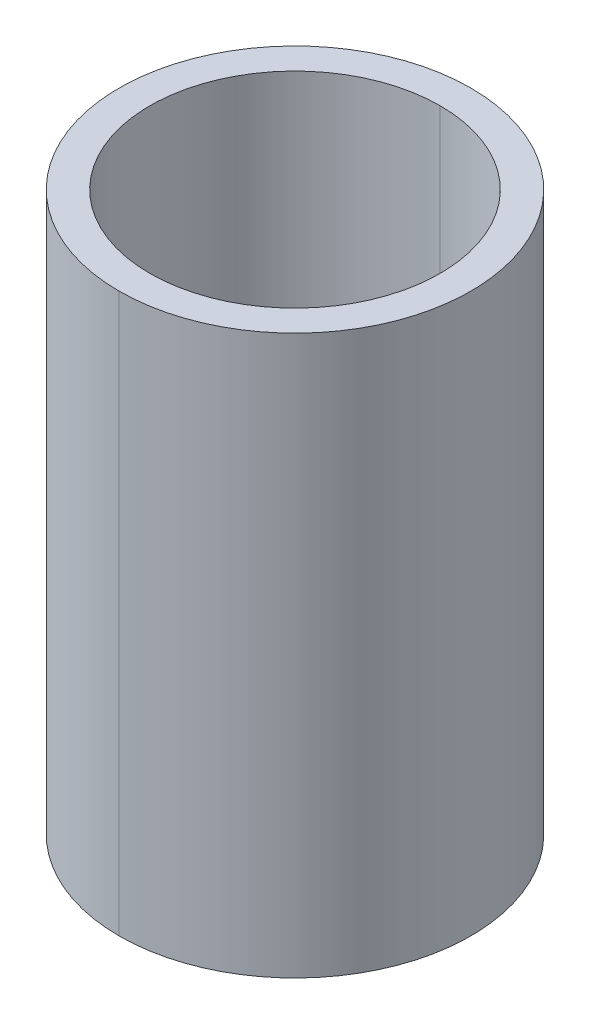
ISO-10303-21;
HEADER;
FILE_DESCRIPTION(('STEP AP214'),'2;1');
FILE_NAME('part.step','',(''),(''),'','','');
FILE_SCHEMA(('AUTOMOTIVE_DESIGN { 1 0 10303 214 1 1 1 1 }'));
ENDSEC;
DATA;
#1=APPLICATION_CONTEXT('core data for automotive mechanical design processes');
#2=APPLICATION_PROTOCOL_DEFINITION('international standard','automotive_design',2000,#1);
#3=PRODUCT_CONTEXT('',#1,'mechanical');
#4=PRODUCT('Part','Part','',(#3));
#5=PRODUCT_RELATED_PRODUCT_CATEGORY('part','',(#4));
#6=PRODUCT_DEFINITION_FORMATION('','',#4);
#7=PRODUCT_DEFINITION_CONTEXT('part definition',#1,'design');
#8=PRODUCT_DEFINITION('design','',#6,#7);
#9=PRODUCT_DEFINITION_SHAPE('','',#8);
#10=(LENGTH_UNIT() NAMED_UNIT(*) SI_UNIT(.MILLI.,.METRE.));
#11=(NAMED_UNIT(*) PLANE_ANGLE_UNIT() SI_UNIT($,.RADIAN.));
#12=(NAMED_UNIT(*) SI_UNIT($,.STERADIAN.) SOLID_ANGLE_UNIT());
#13=UNCERTAINTY_MEASURE_WITH_UNIT(LENGTH_MEASURE(1.E-05),#10,'distance_accuracy_value','');
#14=(GEOMETRIC_REPRESENTATION_CONTEXT(3) GLOBAL_UNCERTAINTY_ASSIGNED_CONTEXT((#13)) GLOBAL_UNIT_ASSIGNED_CONTEXT((#10,
#11,#12)) REPRESENTATION_CONTEXT('',''));
#15=CARTESIAN_POINT('',(0.,0.,0.));
#16=DIRECTION('',(0.,0.,1.));
#17=DIRECTION('',(1.,0.,0.));
#18=AXIS2_PLACEMENT_3D('',#15,#16,#17);
#19=CARTESIAN_POINT('',(0.,6.35,0.));
#20=DIRECTION('',(0.,-1.,0.));
#21=DIRECTION('',(0.,0.,-1.));
#22=AXIS2_PLACEMENT_3D('',#19,#20,#21);
#23=CYLINDRICAL_SURFACE('',#22,3.302);
#24=DIRECTION('',(0.,-1.,0.));
#25=VECTOR('',#24,1.);
#26=CARTESIAN_POINT('',(0.,6.35,3.302));
#27=LINE('',#26,#25);
#28=CARTESIAN_POINT('',(0.,6.35,3.302));
#29=VERTEX_POINT('',#28);
#30=CARTESIAN_POINT('',(0.,-6.35,3.302));
#31=VERTEX_POINT('',#30);
#32=EDGE_CURVE('E83',#29,#31,#27,.T.);
#33=ORIENTED_EDGE('',*,*,#32,.F.);
#34=CARTESIAN_POINT('',(0.,6.35,0.));
#35=DIRECTION('',(0.,1.,0.));
#36=DIRECTION('',(0.,0.,1.));
#37=AXIS2_PLACEMENT_3D('',#34,#35,#36);
#38=CIRCLE('',#37,3.302);
#39=CARTESIAN_POINT('',(0.,6.35,-3.302));
#40=VERTEX_POINT('',#39);
#41=EDGE_CURVE('E77',#29,#40,#38,.T.);
#42=ORIENTED_EDGE('',*,*,#41,.T.);
#43=DIRECTION('',(0.,-1.,0.));
#44=VECTOR('',#43,1.);
#45=CARTESIAN_POINT('',(0.,6.35,-3.302));
#46=LINE('',#45,#44);
#47=CARTESIAN_POINT('',(0.,-6.35,-3.302));
#48=VERTEX_POINT('',#47);
#49=EDGE_CURVE('E80',#40,#48,#46,.T.);
#50=ORIENTED_EDGE('',*,*,#49,.T.);
#51=CARTESIAN_POINT('',(0.,-6.35,0.));
#52=DIRECTION('',(0.,1.,0.));
#53=DIRECTION('',(0.,0.,1.));
#54=AXIS2_PLACEMENT_3D('',#51,#52,#53);
#55=CIRCLE('',#54,3.302);
#56=EDGE_CURVE('E11',#31,#48,#55,.T.);
#57=ORIENTED_EDGE('',*,*,#56,.F.);
#58=EDGE_LOOP('',(#33,#42,#50,#57));
#59=FACE_BOUND('',#58,.T.);
#60=ADVANCED_FACE('F16',(#59),#23,.F.);
#61=CARTESIAN_POINT('',(0.,6.35,0.));
#62=DIRECTION('',(0.,-1.,0.));
#63=DIRECTION('',(0.,0.,-1.));
#64=AXIS2_PLACEMENT_3D('',#61,#62,#63);
#65=CYLINDRICAL_SURFACE('',#64,4.);
#66=DIRECTION('',(0.,-1.,0.));
#67=VECTOR('',#66,1.);
#68=CARTESIAN_POINT('',(0.,6.35,4.));
#69=LINE('',#68,#67);
#70=CARTESIAN_POINT('',(0.,6.35,4.));
#71=VERTEX_POINT('',#70);
#72=CARTESIAN_POINT('',(0.,-6.35,4.));
#73=VERTEX_POINT('',#72);
#74=EDGE_CURVE('E20',#71,#73,#69,.T.);
#75=ORIENTED_EDGE('',*,*,#74,.F.);
#76=CARTESIAN_POINT('',(0.,6.35,0.));
#77=DIRECTION('',(0.,1.,0.));
#78=DIRECTION('',(0.,0.,1.));
#79=AXIS2_PLACEMENT_3D('',#76,#77,#78);
#80=CIRCLE('',#79,4.);
#81=CARTESIAN_POINT('',(0.,6.35,-4.));
#82=VERTEX_POINT('',#81);
#83=EDGE_CURVE('E55',#82,#71,#80,.T.);
#84=ORIENTED_EDGE('',*,*,#83,.F.);
#85=DIRECTION('',(0.,-1.,0.));
#86=VECTOR('',#85,1.);
#87=CARTESIAN_POINT('',(0.,6.35,-4.));
#88=LINE('',#87,#86);
#89=CARTESIAN_POINT('',(0.,-6.35,-4.));
#90=VERTEX_POINT('',#89);
#91=EDGE_CURVE('E108',#82,#90,#88,.T.);
#92=ORIENTED_EDGE('',*,*,#91,.T.);
#93=CARTESIAN_POINT('',(0.,-6.35,0.));
#94=DIRECTION('',(0.,1.,0.));
#95=DIRECTION('',(0.,0.,1.));
#96=AXIS2_PLACEMENT_3D('',#93,#94,#95);
#97=CIRCLE('',#96,4.);
#98=EDGE_CURVE('E27',#90,#73,#97,.T.);
#99=ORIENTED_EDGE('',*,*,#98,.T.);
#100=EDGE_LOOP('',(#75,#84,#92,#99));
#101=FACE_BOUND('',#100,.T.);
#102=ADVANCED_FACE('F120',(#101),#65,.T.);
#103=CARTESIAN_POINT('',(0.,-6.35,0.));
#104=DIRECTION('',(0.,1.,0.));
#105=DIRECTION('',(1.,0.,0.));
#106=AXIS2_PLACEMENT_3D('',#103,#104,#105);
#107=PLANE('',#106);
#108=CARTESIAN_POINT('',(0.,-6.35,0.));
#109=DIRECTION('',(0.,1.,0.));
#110=DIRECTION('',(0.,0.,1.));
#111=AXIS2_PLACEMENT_3D('',#108,#109,#110);
#112=CIRCLE('',#111,3.302);
#113=EDGE_CURVE('E93',#48,#31,#112,.T.);
#114=ORIENTED_EDGE('',*,*,#113,.T.);
#115=ORIENTED_EDGE('',*,*,#56,.T.);
#116=EDGE_LOOP('',(#114,#115));
#117=FACE_BOUND('',#116,.T.);
#118=ORIENTED_EDGE('',*,*,#98,.F.);
#119=CARTESIAN_POINT('',(0.,-6.35,0.));
#120=DIRECTION('',(0.,1.,0.));
#121=DIRECTION('',(0.,0.,1.));
#122=AXIS2_PLACEMENT_3D('',#119,#120,#121);
#123=CIRCLE('',#122,4.);
#124=EDGE_CURVE('E110',#73,#90,#123,.T.);
#125=ORIENTED_EDGE('',*,*,#124,.F.);
#126=EDGE_LOOP('',(#118,#125));
#127=FACE_BOUND('',#126,.T.);
#128=ADVANCED_FACE('F123',(#117,#127),#107,.F.);
#129=CARTESIAN_POINT('',(0.,6.35,0.));
#130=DIRECTION('',(0.,1.,0.));
#131=DIRECTION('',(1.,0.,0.));
#132=AXIS2_PLACEMENT_3D('',#129,#130,#131);
#133=PLANE('',#132);
#134=CARTESIAN_POINT('',(0.,6.35,0.));
#135=DIRECTION('',(0.,1.,0.));
#136=DIRECTION('',(0.,0.,1.));
#137=AXIS2_PLACEMENT_3D('',#134,#135,#136);
#138=CIRCLE('',#137,3.302);
#139=EDGE_CURVE('E91',#40,#29,#138,.T.);
#140=ORIENTED_EDGE('',*,*,#139,.F.);
#141=ORIENTED_EDGE('',*,*,#41,.F.);
#142=EDGE_LOOP('',(#140,#141));
#143=FACE_BOUND('',#142,.T.);
#144=ORIENTED_EDGE('',*,*,#83,.T.);
#145=CARTESIAN_POINT('',(0.,6.35,0.));
#146=DIRECTION('',(0.,1.,0.));
#147=DIRECTION('',(0.,0.,1.));
#148=AXIS2_PLACEMENT_3D('',#145,#146,#147);
#149=CIRCLE('',#148,4.);
#150=EDGE_CURVE('E95',#71,#82,#149,.T.);
#151=ORIENTED_EDGE('',*,*,#150,.T.);
#152=EDGE_LOOP('',(#144,#151));
#153=FACE_BOUND('',#152,.T.);
#154=ADVANCED_FACE('F18',(#143,#153),#133,.T.);
#155=CARTESIAN_POINT('',(0.,6.35,0.));
#156=DIRECTION('',(0.,-1.,0.));
#157=DIRECTION('',(0.,0.,-1.));
#158=AXIS2_PLACEMENT_3D('',#155,#156,#157);
#159=CYLINDRICAL_SURFACE('',#158,4.);
#160=ORIENTED_EDGE('',*,*,#150,.F.);
#161=ORIENTED_EDGE('',*,*,#74,.T.);
#162=ORIENTED_EDGE('',*,*,#124,.T.);
#163=ORIENTED_EDGE('',*,*,#91,.F.);
#164=EDGE_LOOP('',(#160,#161,#162,#163));
#165=FACE_BOUND('',#164,.T.);
#166=ADVANCED_FACE('F125',(#165),#159,.T.);
#167=CARTESIAN_POINT('',(0.,6.35,0.));
#168=DIRECTION('',(0.,-1.,0.));
#169=DIRECTION('',(0.,0.,-1.));
#170=AXIS2_PLACEMENT_3D('',#167,#168,#169);
#171=CYLINDRICAL_SURFACE('',#170,3.302);
#172=ORIENTED_EDGE('',*,*,#139,.T.);
#173=ORIENTED_EDGE('',*,*,#32,.T.);
#174=ORIENTED_EDGE('',*,*,#113,.F.);
#175=ORIENTED_EDGE('',*,*,#49,.F.);
#176=EDGE_LOOP('',(#172,#173,#174,#175));
#177=FACE_BOUND('',#176,.T.);
#178=ADVANCED_FACE('F90',(#177),#171,.F.);
#179=CLOSED_SHELL('',(#60,#102,#128,#154,#166,#178));
#180=MANIFOLD_SOLID_BREP('B1',#179);
#181=ADVANCED_BREP_SHAPE_REPRESENTATION('',(#18,#180),#14);
#182=SHAPE_DEFINITION_REPRESENTATION(#9,#181);
ENDSEC;
END-ISO-10303-21;
